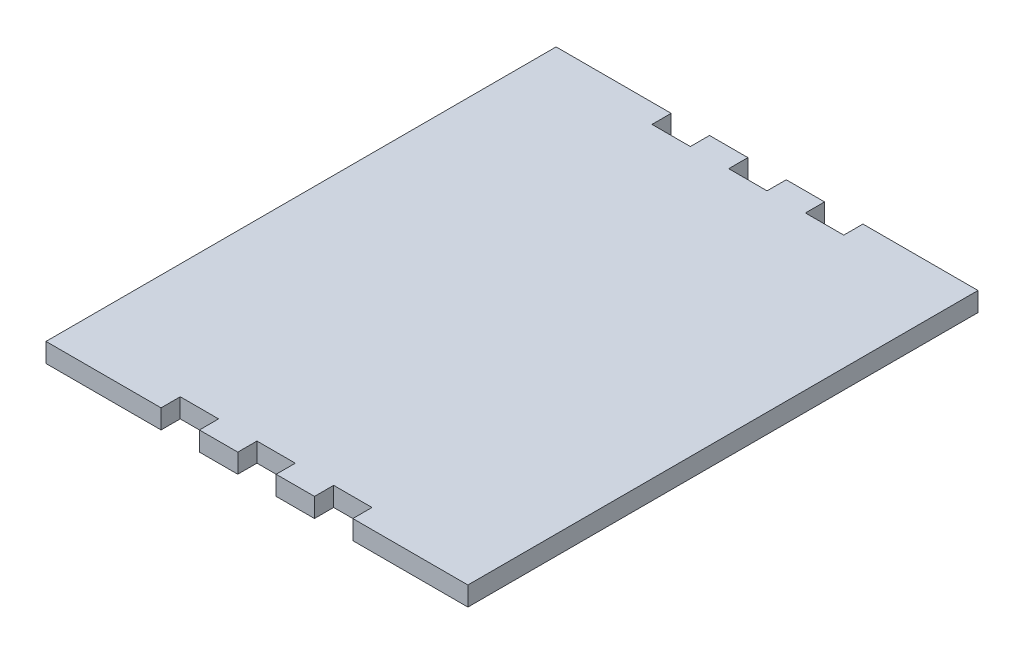
ISO-10303-21;
HEADER;
FILE_DESCRIPTION(('STEP AP214'),'2;1');
FILE_NAME('part.step','',(''),(''),'','','');
FILE_SCHEMA(('AUTOMOTIVE_DESIGN { 1 0 10303 214 1 1 1 1 }'));
ENDSEC;
DATA;
#1=APPLICATION_CONTEXT('core data for automotive mechanical design processes');
#2=APPLICATION_PROTOCOL_DEFINITION('international standard','automotive_design',2000,#1);
#3=PRODUCT_CONTEXT('',#1,'mechanical');
#4=PRODUCT('Part','Part','',(#3));
#5=PRODUCT_RELATED_PRODUCT_CATEGORY('part','',(#4));
#6=PRODUCT_DEFINITION_FORMATION('','',#4);
#7=PRODUCT_DEFINITION_CONTEXT('part definition',#1,'design');
#8=PRODUCT_DEFINITION('design','',#6,#7);
#9=PRODUCT_DEFINITION_SHAPE('','',#8);
#10=(LENGTH_UNIT() NAMED_UNIT(*) SI_UNIT(.MILLI.,.METRE.));
#11=(NAMED_UNIT(*) PLANE_ANGLE_UNIT() SI_UNIT($,.RADIAN.));
#12=(NAMED_UNIT(*) SI_UNIT($,.STERADIAN.) SOLID_ANGLE_UNIT());
#13=UNCERTAINTY_MEASURE_WITH_UNIT(LENGTH_MEASURE(1.E-05),#10,'distance_accuracy_value','');
#14=(GEOMETRIC_REPRESENTATION_CONTEXT(3) GLOBAL_UNCERTAINTY_ASSIGNED_CONTEXT((#13)) GLOBAL_UNIT_ASSIGNED_CONTEXT((#10,
#11,#12)) REPRESENTATION_CONTEXT('',''));
#15=CARTESIAN_POINT('',(0.,0.,0.));
#16=DIRECTION('',(0.,0.,1.));
#17=DIRECTION('',(1.,0.,0.));
#18=AXIS2_PLACEMENT_3D('',#15,#16,#17);
#19=CARTESIAN_POINT('',(-15.875,3.175,-42.2275));
#20=DIRECTION('',(1.,0.,0.));
#21=DIRECTION('',(0.,0.,-1.));
#22=AXIS2_PLACEMENT_3D('',#19,#20,#21);
#23=PLANE('',#22);
#24=DIRECTION('',(0.,0.,1.));
#25=VECTOR('',#24,1.);
#26=CARTESIAN_POINT('',(-15.875,0.,-42.2275));
#27=LINE('',#26,#25);
#28=CARTESIAN_POINT('',(-15.875,0.,-42.2275));
#29=VERTEX_POINT('',#28);
#30=CARTESIAN_POINT('',(-15.875,0.,-39.0525));
#31=VERTEX_POINT('',#30);
#32=EDGE_CURVE('E450',#29,#31,#27,.T.);
#33=ORIENTED_EDGE('',*,*,#32,.F.);
#34=DIRECTION('',(0.,-1.,0.));
#35=VECTOR('',#34,1.);
#36=CARTESIAN_POINT('',(-15.875,3.175,-42.2275));
#37=LINE('',#36,#35);
#38=CARTESIAN_POINT('',(-15.875,3.175,-42.2275));
#39=VERTEX_POINT('',#38);
#40=EDGE_CURVE('E12',#39,#29,#37,.T.);
#41=ORIENTED_EDGE('',*,*,#40,.F.);
#42=DIRECTION('',(0.,0.,1.));
#43=VECTOR('',#42,1.);
#44=CARTESIAN_POINT('',(-15.875,3.175,-42.2275));
#45=LINE('',#44,#43);
#46=CARTESIAN_POINT('',(-15.875,3.175,-39.0525));
#47=VERTEX_POINT('',#46);
#48=EDGE_CURVE('E382',#39,#47,#45,.T.);
#49=ORIENTED_EDGE('',*,*,#48,.T.);
#50=DIRECTION('',(0.,-1.,0.));
#51=VECTOR('',#50,1.);
#52=CARTESIAN_POINT('',(-15.875,3.175,-39.0525));
#53=LINE('',#52,#51);
#54=EDGE_CURVE('E41',#47,#31,#53,.T.);
#55=ORIENTED_EDGE('',*,*,#54,.T.);
#56=EDGE_LOOP('',(#33,#41,#49,#55));
#57=FACE_BOUND('',#56,.T.);
#58=ADVANCED_FACE('F38',(#57),#23,.T.);
#59=CARTESIAN_POINT('',(-34.925,3.175,-42.2275));
#60=DIRECTION('',(0.,0.,-1.));
#61=DIRECTION('',(-1.,0.,0.));
#62=AXIS2_PLACEMENT_3D('',#59,#60,#61);
#63=PLANE('',#62);
#64=DIRECTION('',(1.,0.,0.));
#65=VECTOR('',#64,1.);
#66=CARTESIAN_POINT('',(-34.925,0.,-42.2275));
#67=LINE('',#66,#65);
#68=CARTESIAN_POINT('',(-34.925,0.,-42.2275));
#69=VERTEX_POINT('',#68);
#70=EDGE_CURVE('E385',#69,#29,#67,.T.);
#71=ORIENTED_EDGE('',*,*,#70,.F.);
#72=DIRECTION('',(0.,-1.,0.));
#73=VECTOR('',#72,1.);
#74=CARTESIAN_POINT('',(-34.925,3.175,-42.2275));
#75=LINE('',#74,#73);
#76=CARTESIAN_POINT('',(-34.925,3.175,-42.2275));
#77=VERTEX_POINT('',#76);
#78=EDGE_CURVE('E47',#77,#69,#75,.T.);
#79=ORIENTED_EDGE('',*,*,#78,.F.);
#80=DIRECTION('',(1.,0.,0.));
#81=VECTOR('',#80,1.);
#82=CARTESIAN_POINT('',(-34.925,3.175,-42.2275));
#83=LINE('',#82,#81);
#84=EDGE_CURVE('E248',#77,#39,#83,.T.);
#85=ORIENTED_EDGE('',*,*,#84,.T.);
#86=ORIENTED_EDGE('',*,*,#40,.T.);
#87=EDGE_LOOP('',(#71,#79,#85,#86));
#88=FACE_BOUND('',#87,.T.);
#89=ADVANCED_FACE('F634',(#88),#63,.T.);
#90=CARTESIAN_POINT('',(-34.925,3.175,42.2275));
#91=DIRECTION('',(-1.,0.,0.));
#92=DIRECTION('',(0.,0.,1.));
#93=AXIS2_PLACEMENT_3D('',#90,#91,#92);
#94=PLANE('',#93);
#95=DIRECTION('',(0.,0.,-1.));
#96=VECTOR('',#95,1.);
#97=CARTESIAN_POINT('',(-34.925,0.,42.2275));
#98=LINE('',#97,#96);
#99=CARTESIAN_POINT('',(-34.925,0.,42.2275));
#100=VERTEX_POINT('',#99);
#101=EDGE_CURVE('E233',#100,#69,#98,.T.);
#102=ORIENTED_EDGE('',*,*,#101,.F.);
#103=DIRECTION('',(0.,-1.,0.));
#104=VECTOR('',#103,1.);
#105=CARTESIAN_POINT('',(-34.925,3.175,42.2275));
#106=LINE('',#105,#104);
#107=CARTESIAN_POINT('',(-34.925,3.175,42.2275));
#108=VERTEX_POINT('',#107);
#109=EDGE_CURVE('E227',#108,#100,#106,.T.);
#110=ORIENTED_EDGE('',*,*,#109,.F.);
#111=DIRECTION('',(0.,0.,-1.));
#112=VECTOR('',#111,1.);
#113=CARTESIAN_POINT('',(-34.925,3.175,42.2275));
#114=LINE('',#113,#112);
#115=EDGE_CURVE('E231',#108,#77,#114,.T.);
#116=ORIENTED_EDGE('',*,*,#115,.T.);
#117=ORIENTED_EDGE('',*,*,#78,.T.);
#118=EDGE_LOOP('',(#102,#110,#116,#117));
#119=FACE_BOUND('',#118,.T.);
#120=ADVANCED_FACE('F229',(#119),#94,.T.);
#121=CARTESIAN_POINT('',(-34.925,3.175,42.2275));
#122=DIRECTION('',(0.,0.,-1.));
#123=DIRECTION('',(-1.,0.,0.));
#124=AXIS2_PLACEMENT_3D('',#121,#122,#123);
#125=PLANE('',#124);
#126=DIRECTION('',(1.,0.,0.));
#127=VECTOR('',#126,1.);
#128=CARTESIAN_POINT('',(-34.925,0.,42.2275));
#129=LINE('',#128,#127);
#130=CARTESIAN_POINT('',(-15.875,0.,42.2275));
#131=VERTEX_POINT('',#130);
#132=EDGE_CURVE('E390',#100,#131,#129,.T.);
#133=ORIENTED_EDGE('',*,*,#132,.T.);
#134=DIRECTION('',(0.,-1.,0.));
#135=VECTOR('',#134,1.);
#136=CARTESIAN_POINT('',(-15.875,3.175,42.2275));
#137=LINE('',#136,#135);
#138=CARTESIAN_POINT('',(-15.875,3.175,42.2275));
#139=VERTEX_POINT('',#138);
#140=EDGE_CURVE('E236',#139,#131,#137,.T.);
#141=ORIENTED_EDGE('',*,*,#140,.F.);
#142=DIRECTION('',(1.,0.,0.));
#143=VECTOR('',#142,1.);
#144=CARTESIAN_POINT('',(-34.925,3.175,42.2275));
#145=LINE('',#144,#143);
#146=EDGE_CURVE('E239',#108,#139,#145,.T.);
#147=ORIENTED_EDGE('',*,*,#146,.F.);
#148=ORIENTED_EDGE('',*,*,#109,.T.);
#149=EDGE_LOOP('',(#133,#141,#147,#148));
#150=FACE_BOUND('',#149,.T.);
#151=ADVANCED_FACE('F240',(#150),#125,.F.);
#152=CARTESIAN_POINT('',(-15.875,3.175,42.2275));
#153=DIRECTION('',(-1.,0.,0.));
#154=DIRECTION('',(0.,0.,1.));
#155=AXIS2_PLACEMENT_3D('',#152,#153,#154);
#156=PLANE('',#155);
#157=DIRECTION('',(0.,0.,-1.));
#158=VECTOR('',#157,1.);
#159=CARTESIAN_POINT('',(-15.875,0.,42.2275));
#160=LINE('',#159,#158);
#161=CARTESIAN_POINT('',(-15.875,0.,39.0525));
#162=VERTEX_POINT('',#161);
#163=EDGE_CURVE('E515',#131,#162,#160,.T.);
#164=ORIENTED_EDGE('',*,*,#163,.T.);
#165=DIRECTION('',(0.,-1.,0.));
#166=VECTOR('',#165,1.);
#167=CARTESIAN_POINT('',(-15.875,3.175,39.0525));
#168=LINE('',#167,#166);
#169=CARTESIAN_POINT('',(-15.875,3.175,39.0525));
#170=VERTEX_POINT('',#169);
#171=EDGE_CURVE('E396',#170,#162,#168,.T.);
#172=ORIENTED_EDGE('',*,*,#171,.F.);
#173=DIRECTION('',(0.,0.,-1.));
#174=VECTOR('',#173,1.);
#175=CARTESIAN_POINT('',(-15.875,3.175,42.2275));
#176=LINE('',#175,#174);
#177=EDGE_CURVE('E245',#139,#170,#176,.T.);
#178=ORIENTED_EDGE('',*,*,#177,.F.);
#179=ORIENTED_EDGE('',*,*,#140,.T.);
#180=EDGE_LOOP('',(#164,#172,#178,#179));
#181=FACE_BOUND('',#180,.T.);
#182=ADVANCED_FACE('F518',(#181),#156,.F.);
#183=CARTESIAN_POINT('',(-15.875,3.175,39.0525));
#184=DIRECTION('',(0.,0.,-1.));
#185=DIRECTION('',(-1.,0.,0.));
#186=AXIS2_PLACEMENT_3D('',#183,#184,#185);
#187=PLANE('',#186);
#188=DIRECTION('',(1.,0.,0.));
#189=VECTOR('',#188,1.);
#190=CARTESIAN_POINT('',(-15.875,0.,39.0525));
#191=LINE('',#190,#189);
#192=CARTESIAN_POINT('',(-9.525,0.,39.0525));
#193=VERTEX_POINT('',#192);
#194=EDGE_CURVE('E513',#162,#193,#191,.T.);
#195=ORIENTED_EDGE('',*,*,#194,.T.);
#196=DIRECTION('',(0.,-1.,0.));
#197=VECTOR('',#196,1.);
#198=CARTESIAN_POINT('',(-9.525,3.175,39.0525));
#199=LINE('',#198,#197);
#200=CARTESIAN_POINT('',(-9.525,3.175,39.0525));
#201=VERTEX_POINT('',#200);
#202=EDGE_CURVE('E399',#201,#193,#199,.T.);
#203=ORIENTED_EDGE('',*,*,#202,.F.);
#204=DIRECTION('',(1.,0.,0.));
#205=VECTOR('',#204,1.);
#206=CARTESIAN_POINT('',(-15.875,3.175,39.0525));
#207=LINE('',#206,#205);
#208=EDGE_CURVE('E268',#170,#201,#207,.T.);
#209=ORIENTED_EDGE('',*,*,#208,.F.);
#210=ORIENTED_EDGE('',*,*,#171,.T.);
#211=EDGE_LOOP('',(#195,#203,#209,#210));
#212=FACE_BOUND('',#211,.T.);
#213=ADVANCED_FACE('F525',(#212),#187,.F.);
#214=CARTESIAN_POINT('',(-9.525,3.175,39.0525));
#215=DIRECTION('',(1.,0.,0.));
#216=DIRECTION('',(0.,0.,-1.));
#217=AXIS2_PLACEMENT_3D('',#214,#215,#216);
#218=PLANE('',#217);
#219=DIRECTION('',(0.,0.,1.));
#220=VECTOR('',#219,1.);
#221=CARTESIAN_POINT('',(-9.525,0.,39.0525));
#222=LINE('',#221,#220);
#223=CARTESIAN_POINT('',(-9.52500000000001,0.,42.2275));
#224=VERTEX_POINT('',#223);
#225=EDGE_CURVE('E511',#193,#224,#222,.T.);
#226=ORIENTED_EDGE('',*,*,#225,.T.);
#227=DIRECTION('',(0.,-1.,0.));
#228=VECTOR('',#227,1.);
#229=CARTESIAN_POINT('',(-9.52500000000001,3.175,42.2275));
#230=LINE('',#229,#228);
#231=CARTESIAN_POINT('',(-9.52500000000001,3.175,42.2275));
#232=VERTEX_POINT('',#231);
#233=EDGE_CURVE('E402',#232,#224,#230,.T.);
#234=ORIENTED_EDGE('',*,*,#233,.F.);
#235=DIRECTION('',(0.,0.,1.));
#236=VECTOR('',#235,1.);
#237=CARTESIAN_POINT('',(-9.525,3.175,39.0525));
#238=LINE('',#237,#236);
#239=EDGE_CURVE('E272',#201,#232,#238,.T.);
#240=ORIENTED_EDGE('',*,*,#239,.F.);
#241=ORIENTED_EDGE('',*,*,#202,.T.);
#242=EDGE_LOOP('',(#226,#234,#240,#241));
#243=FACE_BOUND('',#242,.T.);
#244=ADVANCED_FACE('F529',(#243),#218,.F.);
#245=CARTESIAN_POINT('',(-9.52500000000001,3.175,42.2275));
#246=DIRECTION('',(0.,0.,-1.));
#247=DIRECTION('',(-1.,0.,0.));
#248=AXIS2_PLACEMENT_3D('',#245,#246,#247);
#249=PLANE('',#248);
#250=DIRECTION('',(1.,0.,0.));
#251=VECTOR('',#250,1.);
#252=CARTESIAN_POINT('',(-9.52500000000001,0.,42.2275));
#253=LINE('',#252,#251);
#254=CARTESIAN_POINT('',(-3.17500000000001,0.,42.2275));
#255=VERTEX_POINT('',#254);
#256=EDGE_CURVE('E509',#224,#255,#253,.T.);
#257=ORIENTED_EDGE('',*,*,#256,.T.);
#258=DIRECTION('',(0.,-1.,0.));
#259=VECTOR('',#258,1.);
#260=CARTESIAN_POINT('',(-3.17500000000001,3.175,42.2275));
#261=LINE('',#260,#259);
#262=CARTESIAN_POINT('',(-3.17500000000001,3.175,42.2275));
#263=VERTEX_POINT('',#262);
#264=EDGE_CURVE('E405',#263,#255,#261,.T.);
#265=ORIENTED_EDGE('',*,*,#264,.F.);
#266=DIRECTION('',(1.,0.,0.));
#267=VECTOR('',#266,1.);
#268=CARTESIAN_POINT('',(-9.52500000000001,3.175,42.2275));
#269=LINE('',#268,#267);
#270=EDGE_CURVE('E276',#232,#263,#269,.T.);
#271=ORIENTED_EDGE('',*,*,#270,.F.);
#272=ORIENTED_EDGE('',*,*,#233,.T.);
#273=EDGE_LOOP('',(#257,#265,#271,#272));
#274=FACE_BOUND('',#273,.T.);
#275=ADVANCED_FACE('F537',(#274),#249,.F.);
#276=CARTESIAN_POINT('',(-3.17500000000001,3.175,42.2275));
#277=DIRECTION('',(-1.,0.,0.));
#278=DIRECTION('',(0.,0.,1.));
#279=AXIS2_PLACEMENT_3D('',#276,#277,#278);
#280=PLANE('',#279);
#281=DIRECTION('',(0.,0.,-1.));
#282=VECTOR('',#281,1.);
#283=CARTESIAN_POINT('',(-3.17500000000001,0.,42.2275));
#284=LINE('',#283,#282);
#285=CARTESIAN_POINT('',(-3.17500000000001,0.,39.0525));
#286=VERTEX_POINT('',#285);
#287=EDGE_CURVE('E507',#255,#286,#284,.T.);
#288=ORIENTED_EDGE('',*,*,#287,.T.);
#289=DIRECTION('',(0.,-1.,0.));
#290=VECTOR('',#289,1.);
#291=CARTESIAN_POINT('',(-3.17500000000001,3.175,39.0525));
#292=LINE('',#291,#290);
#293=CARTESIAN_POINT('',(-3.17500000000001,3.175,39.0525));
#294=VERTEX_POINT('',#293);
#295=EDGE_CURVE('E408',#294,#286,#292,.T.);
#296=ORIENTED_EDGE('',*,*,#295,.F.);
#297=DIRECTION('',(0.,0.,-1.));
#298=VECTOR('',#297,1.);
#299=CARTESIAN_POINT('',(-3.17500000000001,3.175,42.2275));
#300=LINE('',#299,#298);
#301=EDGE_CURVE('E284',#263,#294,#300,.T.);
#302=ORIENTED_EDGE('',*,*,#301,.F.);
#303=ORIENTED_EDGE('',*,*,#264,.T.);
#304=EDGE_LOOP('',(#288,#296,#302,#303));
#305=FACE_BOUND('',#304,.T.);
#306=ADVANCED_FACE('F540',(#305),#280,.F.);
#307=CARTESIAN_POINT('',(-3.17500000000001,3.175,39.0525));
#308=DIRECTION('',(0.,0.,-1.));
#309=DIRECTION('',(-1.,0.,0.));
#310=AXIS2_PLACEMENT_3D('',#307,#308,#309);
#311=PLANE('',#310);
#312=DIRECTION('',(1.,0.,0.));
#313=VECTOR('',#312,1.);
#314=CARTESIAN_POINT('',(-3.17500000000001,0.,39.0525));
#315=LINE('',#314,#313);
#316=CARTESIAN_POINT('',(3.17499999999999,0.,39.0525));
#317=VERTEX_POINT('',#316);
#318=EDGE_CURVE('E505',#286,#317,#315,.T.);
#319=ORIENTED_EDGE('',*,*,#318,.T.);
#320=DIRECTION('',(0.,-1.,0.));
#321=VECTOR('',#320,1.);
#322=CARTESIAN_POINT('',(3.17499999999999,3.175,39.0525));
#323=LINE('',#322,#321);
#324=CARTESIAN_POINT('',(3.17499999999999,3.175,39.0525));
#325=VERTEX_POINT('',#324);
#326=EDGE_CURVE('E411',#325,#317,#323,.T.);
#327=ORIENTED_EDGE('',*,*,#326,.F.);
#328=DIRECTION('',(1.,0.,0.));
#329=VECTOR('',#328,1.);
#330=CARTESIAN_POINT('',(-3.17500000000001,3.175,39.0525));
#331=LINE('',#330,#329);
#332=EDGE_CURVE('E287',#294,#325,#331,.T.);
#333=ORIENTED_EDGE('',*,*,#332,.F.);
#334=ORIENTED_EDGE('',*,*,#295,.T.);
#335=EDGE_LOOP('',(#319,#327,#333,#334));
#336=FACE_BOUND('',#335,.T.);
#337=ADVANCED_FACE('F545',(#336),#311,.F.);
#338=CARTESIAN_POINT('',(3.17499999999999,3.175,39.0525));
#339=DIRECTION('',(1.,0.,0.));
#340=DIRECTION('',(0.,0.,-1.));
#341=AXIS2_PLACEMENT_3D('',#338,#339,#340);
#342=PLANE('',#341);
#343=DIRECTION('',(0.,0.,1.));
#344=VECTOR('',#343,1.);
#345=CARTESIAN_POINT('',(3.17499999999999,0.,39.0525));
#346=LINE('',#345,#344);
#347=CARTESIAN_POINT('',(3.17499999999999,0.,42.2275));
#348=VERTEX_POINT('',#347);
#349=EDGE_CURVE('E502',#317,#348,#346,.T.);
#350=ORIENTED_EDGE('',*,*,#349,.T.);
#351=DIRECTION('',(0.,-1.,0.));
#352=VECTOR('',#351,1.);
#353=CARTESIAN_POINT('',(3.17499999999999,3.175,42.2275));
#354=LINE('',#353,#352);
#355=CARTESIAN_POINT('',(3.17499999999999,3.175,42.2275));
#356=VERTEX_POINT('',#355);
#357=EDGE_CURVE('E414',#356,#348,#354,.T.);
#358=ORIENTED_EDGE('',*,*,#357,.F.);
#359=DIRECTION('',(0.,0.,1.));
#360=VECTOR('',#359,1.);
#361=CARTESIAN_POINT('',(3.17499999999999,3.175,39.0525));
#362=LINE('',#361,#360);
#363=EDGE_CURVE('E291',#325,#356,#362,.T.);
#364=ORIENTED_EDGE('',*,*,#363,.F.);
#365=ORIENTED_EDGE('',*,*,#326,.T.);
#366=EDGE_LOOP('',(#350,#358,#364,#365));
#367=FACE_BOUND('',#366,.T.);
#368=ADVANCED_FACE('F552',(#367),#342,.F.);
#369=CARTESIAN_POINT('',(9.52499999999999,3.175,42.2275));
#370=DIRECTION('',(0.,0.,1.));
#371=DIRECTION('',(1.,0.,0.));
#372=AXIS2_PLACEMENT_3D('',#369,#370,#371);
#373=PLANE('',#372);
#374=DIRECTION('',(-1.,0.,0.));
#375=VECTOR('',#374,1.);
#376=CARTESIAN_POINT('',(9.52499999999999,0.,42.2275));
#377=LINE('',#376,#375);
#378=CARTESIAN_POINT('',(9.52499999999999,0.,42.2275));
#379=VERTEX_POINT('',#378);
#380=EDGE_CURVE('E499',#379,#348,#377,.T.);
#381=ORIENTED_EDGE('',*,*,#380,.F.);
#382=DIRECTION('',(0.,-1.,0.));
#383=VECTOR('',#382,1.);
#384=CARTESIAN_POINT('',(9.52499999999999,3.175,42.2275));
#385=LINE('',#384,#383);
#386=CARTESIAN_POINT('',(9.52499999999999,3.175,42.2275));
#387=VERTEX_POINT('',#386);
#388=EDGE_CURVE('E416',#387,#379,#385,.T.);
#389=ORIENTED_EDGE('',*,*,#388,.F.);
#390=DIRECTION('',(-1.,0.,0.));
#391=VECTOR('',#390,1.);
#392=CARTESIAN_POINT('',(9.52499999999999,3.175,42.2275));
#393=LINE('',#392,#391);
#394=EDGE_CURVE('E295',#387,#356,#393,.T.);
#395=ORIENTED_EDGE('',*,*,#394,.T.);
#396=ORIENTED_EDGE('',*,*,#357,.T.);
#397=EDGE_LOOP('',(#381,#389,#395,#396));
#398=FACE_BOUND('',#397,.T.);
#399=ADVANCED_FACE('F556',(#398),#373,.T.);
#400=CARTESIAN_POINT('',(9.525,3.175,39.0525));
#401=DIRECTION('',(1.,0.,0.));
#402=DIRECTION('',(0.,0.,-1.));
#403=AXIS2_PLACEMENT_3D('',#400,#401,#402);
#404=PLANE('',#403);
#405=DIRECTION('',(0.,0.,1.));
#406=VECTOR('',#405,1.);
#407=CARTESIAN_POINT('',(9.525,0.,39.0525));
#408=LINE('',#407,#406);
#409=CARTESIAN_POINT('',(9.525,0.,39.0525));
#410=VERTEX_POINT('',#409);
#411=EDGE_CURVE('E496',#410,#379,#408,.T.);
#412=ORIENTED_EDGE('',*,*,#411,.F.);
#413=DIRECTION('',(0.,-1.,0.));
#414=VECTOR('',#413,1.);
#415=CARTESIAN_POINT('',(9.525,3.175,39.0525));
#416=LINE('',#415,#414);
#417=CARTESIAN_POINT('',(9.525,3.175,39.0525));
#418=VERTEX_POINT('',#417);
#419=EDGE_CURVE('E418',#418,#410,#416,.T.);
#420=ORIENTED_EDGE('',*,*,#419,.F.);
#421=DIRECTION('',(0.,0.,1.));
#422=VECTOR('',#421,1.);
#423=CARTESIAN_POINT('',(9.525,3.175,39.0525));
#424=LINE('',#423,#422);
#425=EDGE_CURVE('E303',#418,#387,#424,.T.);
#426=ORIENTED_EDGE('',*,*,#425,.T.);
#427=ORIENTED_EDGE('',*,*,#388,.T.);
#428=EDGE_LOOP('',(#412,#420,#426,#427));
#429=FACE_BOUND('',#428,.T.);
#430=ADVANCED_FACE('F624',(#429),#404,.T.);
#431=CARTESIAN_POINT('',(15.875,3.175,39.0525));
#432=DIRECTION('',(0.,0.,1.));
#433=DIRECTION('',(1.,0.,0.));
#434=AXIS2_PLACEMENT_3D('',#431,#432,#433);
#435=PLANE('',#434);
#436=DIRECTION('',(-1.,0.,0.));
#437=VECTOR('',#436,1.);
#438=CARTESIAN_POINT('',(15.875,0.,39.0525));
#439=LINE('',#438,#437);
#440=CARTESIAN_POINT('',(15.875,0.,39.0525));
#441=VERTEX_POINT('',#440);
#442=EDGE_CURVE('E493',#441,#410,#439,.T.);
#443=ORIENTED_EDGE('',*,*,#442,.F.);
#444=DIRECTION('',(0.,-1.,0.));
#445=VECTOR('',#444,1.);
#446=CARTESIAN_POINT('',(15.875,3.175,39.0525));
#447=LINE('',#446,#445);
#448=CARTESIAN_POINT('',(15.875,3.175,39.0525));
#449=VERTEX_POINT('',#448);
#450=EDGE_CURVE('E420',#449,#441,#447,.T.);
#451=ORIENTED_EDGE('',*,*,#450,.F.);
#452=DIRECTION('',(-1.,0.,0.));
#453=VECTOR('',#452,1.);
#454=CARTESIAN_POINT('',(15.875,3.175,39.0525));
#455=LINE('',#454,#453);
#456=EDGE_CURVE('E307',#449,#418,#455,.T.);
#457=ORIENTED_EDGE('',*,*,#456,.T.);
#458=ORIENTED_EDGE('',*,*,#419,.T.);
#459=EDGE_LOOP('',(#443,#451,#457,#458));
#460=FACE_BOUND('',#459,.T.);
#461=ADVANCED_FACE('F621',(#460),#435,.T.);
#462=CARTESIAN_POINT('',(15.875,3.175,42.2275));
#463=DIRECTION('',(-1.,0.,0.));
#464=DIRECTION('',(0.,0.,1.));
#465=AXIS2_PLACEMENT_3D('',#462,#463,#464);
#466=PLANE('',#465);
#467=DIRECTION('',(0.,0.,-1.));
#468=VECTOR('',#467,1.);
#469=CARTESIAN_POINT('',(15.875,0.,42.2275));
#470=LINE('',#469,#468);
#471=CARTESIAN_POINT('',(15.875,0.,42.2275));
#472=VERTEX_POINT('',#471);
#473=EDGE_CURVE('E490',#472,#441,#470,.T.);
#474=ORIENTED_EDGE('',*,*,#473,.F.);
#475=DIRECTION('',(0.,-1.,0.));
#476=VECTOR('',#475,1.);
#477=CARTESIAN_POINT('',(15.875,3.175,42.2275));
#478=LINE('',#477,#476);
#479=CARTESIAN_POINT('',(15.875,3.175,42.2275));
#480=VERTEX_POINT('',#479);
#481=EDGE_CURVE('E422',#480,#472,#478,.T.);
#482=ORIENTED_EDGE('',*,*,#481,.F.);
#483=DIRECTION('',(0.,0.,-1.));
#484=VECTOR('',#483,1.);
#485=CARTESIAN_POINT('',(15.875,3.175,42.2275));
#486=LINE('',#485,#484);
#487=EDGE_CURVE('E312',#480,#449,#486,.T.);
#488=ORIENTED_EDGE('',*,*,#487,.T.);
#489=ORIENTED_EDGE('',*,*,#450,.T.);
#490=EDGE_LOOP('',(#474,#482,#488,#489));
#491=FACE_BOUND('',#490,.T.);
#492=ADVANCED_FACE('F617',(#491),#466,.T.);
#493=CARTESIAN_POINT('',(15.875,3.175,42.2275));
#494=DIRECTION('',(0.,0.,-1.));
#495=DIRECTION('',(-1.,0.,0.));
#496=AXIS2_PLACEMENT_3D('',#493,#494,#495);
#497=PLANE('',#496);
#498=DIRECTION('',(1.,0.,0.));
#499=VECTOR('',#498,1.);
#500=CARTESIAN_POINT('',(15.875,0.,42.2275));
#501=LINE('',#500,#499);
#502=CARTESIAN_POINT('',(34.925,0.,42.2275));
#503=VERTEX_POINT('',#502);
#504=EDGE_CURVE('E488',#472,#503,#501,.T.);
#505=ORIENTED_EDGE('',*,*,#504,.T.);
#506=DIRECTION('',(0.,-1.,0.));
#507=VECTOR('',#506,1.);
#508=CARTESIAN_POINT('',(34.925,3.175,42.2275));
#509=LINE('',#508,#507);
#510=CARTESIAN_POINT('',(34.925,3.175,42.2275));
#511=VERTEX_POINT('',#510);
#512=EDGE_CURVE('E424',#511,#503,#509,.T.);
#513=ORIENTED_EDGE('',*,*,#512,.F.);
#514=DIRECTION('',(1.,0.,0.));
#515=VECTOR('',#514,1.);
#516=CARTESIAN_POINT('',(15.875,3.175,42.2275));
#517=LINE('',#516,#515);
#518=EDGE_CURVE('E317',#480,#511,#517,.T.);
#519=ORIENTED_EDGE('',*,*,#518,.F.);
#520=ORIENTED_EDGE('',*,*,#481,.T.);
#521=EDGE_LOOP('',(#505,#513,#519,#520));
#522=FACE_BOUND('',#521,.T.);
#523=ADVANCED_FACE('F614',(#522),#497,.F.);
#524=CARTESIAN_POINT('',(34.925,3.175,42.2275));
#525=DIRECTION('',(-1.,0.,0.));
#526=DIRECTION('',(0.,0.,1.));
#527=AXIS2_PLACEMENT_3D('',#524,#525,#526);
#528=PLANE('',#527);
#529=DIRECTION('',(0.,0.,-1.));
#530=VECTOR('',#529,1.);
#531=CARTESIAN_POINT('',(34.925,0.,42.2275));
#532=LINE('',#531,#530);
#533=CARTESIAN_POINT('',(34.925,0.,-42.2275));
#534=VERTEX_POINT('',#533);
#535=EDGE_CURVE('E485',#503,#534,#532,.T.);
#536=ORIENTED_EDGE('',*,*,#535,.T.);
#537=DIRECTION('',(0.,-1.,0.));
#538=VECTOR('',#537,1.);
#539=CARTESIAN_POINT('',(34.925,3.175,-42.2275));
#540=LINE('',#539,#538);
#541=CARTESIAN_POINT('',(34.925,3.175,-42.2275));
#542=VERTEX_POINT('',#541);
#543=EDGE_CURVE('E427',#542,#534,#540,.T.);
#544=ORIENTED_EDGE('',*,*,#543,.F.);
#545=DIRECTION('',(0.,0.,-1.));
#546=VECTOR('',#545,1.);
#547=CARTESIAN_POINT('',(34.925,3.175,42.2275));
#548=LINE('',#547,#546);
#549=EDGE_CURVE('E325',#511,#542,#548,.T.);
#550=ORIENTED_EDGE('',*,*,#549,.F.);
#551=ORIENTED_EDGE('',*,*,#512,.T.);
#552=EDGE_LOOP('',(#536,#544,#550,#551));
#553=FACE_BOUND('',#552,.T.);
#554=ADVANCED_FACE('F609',(#553),#528,.F.);
#555=CARTESIAN_POINT('',(15.875,3.175,-42.2275));
#556=DIRECTION('',(0.,0.,-1.));
#557=DIRECTION('',(-1.,0.,0.));
#558=AXIS2_PLACEMENT_3D('',#555,#556,#557);
#559=PLANE('',#558);
#560=DIRECTION('',(1.,0.,0.));
#561=VECTOR('',#560,1.);
#562=CARTESIAN_POINT('',(15.875,0.,-42.2275));
#563=LINE('',#562,#561);
#564=CARTESIAN_POINT('',(15.875,0.,-42.2275));
#565=VERTEX_POINT('',#564);
#566=EDGE_CURVE('E482',#565,#534,#563,.T.);
#567=ORIENTED_EDGE('',*,*,#566,.F.);
#568=DIRECTION('',(0.,-1.,0.));
#569=VECTOR('',#568,1.);
#570=CARTESIAN_POINT('',(15.875,3.175,-42.2275));
#571=LINE('',#570,#569);
#572=CARTESIAN_POINT('',(15.875,3.175,-42.2275));
#573=VERTEX_POINT('',#572);
#574=EDGE_CURVE('E429',#573,#565,#571,.T.);
#575=ORIENTED_EDGE('',*,*,#574,.F.);
#576=DIRECTION('',(1.,0.,0.));
#577=VECTOR('',#576,1.);
#578=CARTESIAN_POINT('',(15.875,3.175,-42.2275));
#579=LINE('',#578,#577);
#580=EDGE_CURVE('E328',#573,#542,#579,.T.);
#581=ORIENTED_EDGE('',*,*,#580,.T.);
#582=ORIENTED_EDGE('',*,*,#543,.T.);
#583=EDGE_LOOP('',(#567,#575,#581,#582));
#584=FACE_BOUND('',#583,.T.);
#585=ADVANCED_FACE('F603',(#584),#559,.T.);
#586=CARTESIAN_POINT('',(15.875,3.175,-42.2275));
#587=DIRECTION('',(1.,0.,0.));
#588=DIRECTION('',(0.,0.,-1.));
#589=AXIS2_PLACEMENT_3D('',#586,#587,#588);
#590=PLANE('',#589);
#591=DIRECTION('',(0.,0.,1.));
#592=VECTOR('',#591,1.);
#593=CARTESIAN_POINT('',(15.875,0.,-42.2275));
#594=LINE('',#593,#592);
#595=CARTESIAN_POINT('',(15.875,0.,-39.0525));
#596=VERTEX_POINT('',#595);
#597=EDGE_CURVE('E480',#565,#596,#594,.T.);
#598=ORIENTED_EDGE('',*,*,#597,.T.);
#599=DIRECTION('',(0.,-1.,0.));
#600=VECTOR('',#599,1.);
#601=CARTESIAN_POINT('',(15.875,3.175,-39.0525));
#602=LINE('',#601,#600);
#603=CARTESIAN_POINT('',(15.875,3.175,-39.0525));
#604=VERTEX_POINT('',#603);
#605=EDGE_CURVE('E431',#604,#596,#602,.T.);
#606=ORIENTED_EDGE('',*,*,#605,.F.);
#607=DIRECTION('',(0.,0.,1.));
#608=VECTOR('',#607,1.);
#609=CARTESIAN_POINT('',(15.875,3.175,-42.2275));
#610=LINE('',#609,#608);
#611=EDGE_CURVE('E333',#573,#604,#610,.T.);
#612=ORIENTED_EDGE('',*,*,#611,.F.);
#613=ORIENTED_EDGE('',*,*,#574,.T.);
#614=EDGE_LOOP('',(#598,#606,#612,#613));
#615=FACE_BOUND('',#614,.T.);
#616=ADVANCED_FACE('F600',(#615),#590,.F.);
#617=CARTESIAN_POINT('',(15.875,3.175,-39.0525));
#618=DIRECTION('',(0.,0.,1.));
#619=DIRECTION('',(1.,0.,0.));
#620=AXIS2_PLACEMENT_3D('',#617,#618,#619);
#621=PLANE('',#620);
#622=DIRECTION('',(-1.,0.,0.));
#623=VECTOR('',#622,1.);
#624=CARTESIAN_POINT('',(15.875,0.,-39.0525));
#625=LINE('',#624,#623);
#626=CARTESIAN_POINT('',(9.525,0.,-39.0525));
#627=VERTEX_POINT('',#626);
#628=EDGE_CURVE('E478',#596,#627,#625,.T.);
#629=ORIENTED_EDGE('',*,*,#628,.T.);
#630=DIRECTION('',(0.,-1.,0.));
#631=VECTOR('',#630,1.);
#632=CARTESIAN_POINT('',(9.525,3.175,-39.0525));
#633=LINE('',#632,#631);
#634=CARTESIAN_POINT('',(9.525,3.175,-39.0525));
#635=VERTEX_POINT('',#634);
#636=EDGE_CURVE('E434',#635,#627,#633,.T.);
#637=ORIENTED_EDGE('',*,*,#636,.F.);
#638=DIRECTION('',(-1.,0.,0.));
#639=VECTOR('',#638,1.);
#640=CARTESIAN_POINT('',(15.875,3.175,-39.0525));
#641=LINE('',#640,#639);
#642=EDGE_CURVE('E337',#604,#635,#641,.T.);
#643=ORIENTED_EDGE('',*,*,#642,.F.);
#644=ORIENTED_EDGE('',*,*,#605,.T.);
#645=EDGE_LOOP('',(#629,#637,#643,#644));
#646=FACE_BOUND('',#645,.T.);
#647=ADVANCED_FACE('F595',(#646),#621,.F.);
#648=CARTESIAN_POINT('',(9.525,3.175,-39.0525));
#649=DIRECTION('',(-1.,0.,0.));
#650=DIRECTION('',(0.,0.,1.));
#651=AXIS2_PLACEMENT_3D('',#648,#649,#650);
#652=PLANE('',#651);
#653=DIRECTION('',(0.,0.,-1.));
#654=VECTOR('',#653,1.);
#655=CARTESIAN_POINT('',(9.525,0.,-39.0525));
#656=LINE('',#655,#654);
#657=CARTESIAN_POINT('',(9.52499999999999,0.,-42.2275));
#658=VERTEX_POINT('',#657);
#659=EDGE_CURVE('E475',#627,#658,#656,.T.);
#660=ORIENTED_EDGE('',*,*,#659,.T.);
#661=DIRECTION('',(0.,-1.,0.));
#662=VECTOR('',#661,1.);
#663=CARTESIAN_POINT('',(9.52499999999999,3.175,-42.2275));
#664=LINE('',#663,#662);
#665=CARTESIAN_POINT('',(9.52499999999999,3.175,-42.2275));
#666=VERTEX_POINT('',#665);
#667=EDGE_CURVE('E437',#666,#658,#664,.T.);
#668=ORIENTED_EDGE('',*,*,#667,.F.);
#669=DIRECTION('',(0.,0.,-1.));
#670=VECTOR('',#669,1.);
#671=CARTESIAN_POINT('',(9.525,3.175,-39.0525));
#672=LINE('',#671,#670);
#673=EDGE_CURVE('E345',#635,#666,#672,.T.);
#674=ORIENTED_EDGE('',*,*,#673,.F.);
#675=ORIENTED_EDGE('',*,*,#636,.T.);
#676=EDGE_LOOP('',(#660,#668,#674,#675));
#677=FACE_BOUND('',#676,.T.);
#678=ADVANCED_FACE('F589',(#677),#652,.F.);
#679=CARTESIAN_POINT('',(3.17499999999999,3.175,-42.2275));
#680=DIRECTION('',(0.,0.,-1.));
#681=DIRECTION('',(-1.,0.,0.));
#682=AXIS2_PLACEMENT_3D('',#679,#680,#681);
#683=PLANE('',#682);
#684=DIRECTION('',(1.,0.,0.));
#685=VECTOR('',#684,1.);
#686=CARTESIAN_POINT('',(3.17499999999999,0.,-42.2275));
#687=LINE('',#686,#685);
#688=CARTESIAN_POINT('',(3.17499999999999,0.,-42.2275));
#689=VERTEX_POINT('',#688);
#690=EDGE_CURVE('E472',#689,#658,#687,.T.);
#691=ORIENTED_EDGE('',*,*,#690,.F.);
#692=DIRECTION('',(0.,-1.,0.));
#693=VECTOR('',#692,1.);
#694=CARTESIAN_POINT('',(3.17499999999999,3.175,-42.2275));
#695=LINE('',#694,#693);
#696=CARTESIAN_POINT('',(3.17499999999999,3.175,-42.2275));
#697=VERTEX_POINT('',#696);
#698=EDGE_CURVE('E439',#697,#689,#695,.T.);
#699=ORIENTED_EDGE('',*,*,#698,.F.);
#700=DIRECTION('',(1.,0.,0.));
#701=VECTOR('',#700,1.);
#702=CARTESIAN_POINT('',(3.17499999999999,3.175,-42.2275));
#703=LINE('',#702,#701);
#704=EDGE_CURVE('E348',#697,#666,#703,.T.);
#705=ORIENTED_EDGE('',*,*,#704,.T.);
#706=ORIENTED_EDGE('',*,*,#667,.T.);
#707=EDGE_LOOP('',(#691,#699,#705,#706));
#708=FACE_BOUND('',#707,.T.);
#709=ADVANCED_FACE('F585',(#708),#683,.T.);
#710=CARTESIAN_POINT('',(3.17499999999999,3.175,-39.0525));
#711=DIRECTION('',(-1.,0.,0.));
#712=DIRECTION('',(0.,0.,1.));
#713=AXIS2_PLACEMENT_3D('',#710,#711,#712);
#714=PLANE('',#713);
#715=DIRECTION('',(0.,0.,-1.));
#716=VECTOR('',#715,1.);
#717=CARTESIAN_POINT('',(3.17499999999999,0.,-39.0525));
#718=LINE('',#717,#716);
#719=CARTESIAN_POINT('',(3.17499999999999,0.,-39.0525));
#720=VERTEX_POINT('',#719);
#721=EDGE_CURVE('E469',#720,#689,#718,.T.);
#722=ORIENTED_EDGE('',*,*,#721,.F.);
#723=DIRECTION('',(0.,-1.,0.));
#724=VECTOR('',#723,1.);
#725=CARTESIAN_POINT('',(3.17499999999999,3.175,-39.0525));
#726=LINE('',#725,#724);
#727=CARTESIAN_POINT('',(3.17499999999999,3.175,-39.0525));
#728=VERTEX_POINT('',#727);
#729=EDGE_CURVE('E441',#728,#720,#726,.T.);
#730=ORIENTED_EDGE('',*,*,#729,.F.);
#731=DIRECTION('',(0.,0.,-1.));
#732=VECTOR('',#731,1.);
#733=CARTESIAN_POINT('',(3.17499999999999,3.175,-39.0525));
#734=LINE('',#733,#732);
#735=EDGE_CURVE('E353',#728,#697,#734,.T.);
#736=ORIENTED_EDGE('',*,*,#735,.T.);
#737=ORIENTED_EDGE('',*,*,#698,.T.);
#738=EDGE_LOOP('',(#722,#730,#736,#737));
#739=FACE_BOUND('',#738,.T.);
#740=ADVANCED_FACE('F583',(#739),#714,.T.);
#741=CARTESIAN_POINT('',(-3.17500000000001,3.175,-39.0525));
#742=DIRECTION('',(0.,0.,-1.));
#743=DIRECTION('',(-1.,0.,0.));
#744=AXIS2_PLACEMENT_3D('',#741,#742,#743);
#745=PLANE('',#744);
#746=DIRECTION('',(1.,0.,0.));
#747=VECTOR('',#746,1.);
#748=CARTESIAN_POINT('',(-3.17500000000001,0.,-39.0525));
#749=LINE('',#748,#747);
#750=CARTESIAN_POINT('',(-3.17500000000001,0.,-39.0525));
#751=VERTEX_POINT('',#750);
#752=EDGE_CURVE('E466',#751,#720,#749,.T.);
#753=ORIENTED_EDGE('',*,*,#752,.F.);
#754=DIRECTION('',(0.,-1.,0.));
#755=VECTOR('',#754,1.);
#756=CARTESIAN_POINT('',(-3.17500000000001,3.175,-39.0525));
#757=LINE('',#756,#755);
#758=CARTESIAN_POINT('',(-3.17500000000001,3.175,-39.0525));
#759=VERTEX_POINT('',#758);
#760=EDGE_CURVE('E443',#759,#751,#757,.T.);
#761=ORIENTED_EDGE('',*,*,#760,.F.);
#762=DIRECTION('',(1.,0.,0.));
#763=VECTOR('',#762,1.);
#764=CARTESIAN_POINT('',(-3.17500000000001,3.175,-39.0525));
#765=LINE('',#764,#763);
#766=EDGE_CURVE('E358',#759,#728,#765,.T.);
#767=ORIENTED_EDGE('',*,*,#766,.T.);
#768=ORIENTED_EDGE('',*,*,#729,.T.);
#769=EDGE_LOOP('',(#753,#761,#767,#768));
#770=FACE_BOUND('',#769,.T.);
#771=ADVANCED_FACE('F565',(#770),#745,.T.);
#772=CARTESIAN_POINT('',(-3.17500000000001,3.175,-42.2275));
#773=DIRECTION('',(1.,0.,0.));
#774=DIRECTION('',(0.,0.,-1.));
#775=AXIS2_PLACEMENT_3D('',#772,#773,#774);
#776=PLANE('',#775);
#777=DIRECTION('',(0.,0.,1.));
#778=VECTOR('',#777,1.);
#779=CARTESIAN_POINT('',(-3.17500000000001,0.,-42.2275));
#780=LINE('',#779,#778);
#781=CARTESIAN_POINT('',(-3.17500000000001,0.,-42.2275));
#782=VERTEX_POINT('',#781);
#783=EDGE_CURVE('E463',#782,#751,#780,.T.);
#784=ORIENTED_EDGE('',*,*,#783,.F.);
#785=DIRECTION('',(0.,-1.,0.));
#786=VECTOR('',#785,1.);
#787=CARTESIAN_POINT('',(-3.17500000000001,3.175,-42.2275));
#788=LINE('',#787,#786);
#789=CARTESIAN_POINT('',(-3.17500000000001,3.175,-42.2275));
#790=VERTEX_POINT('',#789);
#791=EDGE_CURVE('E445',#790,#782,#788,.T.);
#792=ORIENTED_EDGE('',*,*,#791,.F.);
#793=DIRECTION('',(0.,0.,1.));
#794=VECTOR('',#793,1.);
#795=CARTESIAN_POINT('',(-3.17500000000001,3.175,-42.2275));
#796=LINE('',#795,#794);
#797=EDGE_CURVE('E365',#790,#759,#796,.T.);
#798=ORIENTED_EDGE('',*,*,#797,.T.);
#799=ORIENTED_EDGE('',*,*,#760,.T.);
#800=EDGE_LOOP('',(#784,#792,#798,#799));
#801=FACE_BOUND('',#800,.T.);
#802=ADVANCED_FACE('F573',(#801),#776,.T.);
#803=CARTESIAN_POINT('',(-9.52500000000001,3.175,-42.2275));
#804=DIRECTION('',(0.,0.,-1.));
#805=DIRECTION('',(-1.,0.,0.));
#806=AXIS2_PLACEMENT_3D('',#803,#804,#805);
#807=PLANE('',#806);
#808=DIRECTION('',(1.,0.,0.));
#809=VECTOR('',#808,1.);
#810=CARTESIAN_POINT('',(-9.52500000000001,0.,-42.2275));
#811=LINE('',#810,#809);
#812=CARTESIAN_POINT('',(-9.52500000000001,0.,-42.2275));
#813=VERTEX_POINT('',#812);
#814=EDGE_CURVE('E460',#813,#782,#811,.T.);
#815=ORIENTED_EDGE('',*,*,#814,.F.);
#816=DIRECTION('',(0.,-1.,0.));
#817=VECTOR('',#816,1.);
#818=CARTESIAN_POINT('',(-9.52500000000001,3.175,-42.2275));
#819=LINE('',#818,#817);
#820=CARTESIAN_POINT('',(-9.52500000000001,3.175,-42.2275));
#821=VERTEX_POINT('',#820);
#822=EDGE_CURVE('E447',#821,#813,#819,.T.);
#823=ORIENTED_EDGE('',*,*,#822,.F.);
#824=DIRECTION('',(1.,0.,0.));
#825=VECTOR('',#824,1.);
#826=CARTESIAN_POINT('',(-9.52500000000001,3.175,-42.2275));
#827=LINE('',#826,#825);
#828=EDGE_CURVE('E369',#821,#790,#827,.T.);
#829=ORIENTED_EDGE('',*,*,#828,.T.);
#830=ORIENTED_EDGE('',*,*,#791,.T.);
#831=EDGE_LOOP('',(#815,#823,#829,#830));
#832=FACE_BOUND('',#831,.T.);
#833=ADVANCED_FACE('F576',(#832),#807,.T.);
#834=CARTESIAN_POINT('',(-9.525,3.175,-39.0525));
#835=DIRECTION('',(-1.,0.,0.));
#836=DIRECTION('',(0.,0.,1.));
#837=AXIS2_PLACEMENT_3D('',#834,#835,#836);
#838=PLANE('',#837);
#839=DIRECTION('',(0.,0.,-1.));
#840=VECTOR('',#839,1.);
#841=CARTESIAN_POINT('',(-9.525,0.,-39.0525));
#842=LINE('',#841,#840);
#843=CARTESIAN_POINT('',(-9.525,0.,-39.0525));
#844=VERTEX_POINT('',#843);
#845=EDGE_CURVE('E455',#844,#813,#842,.T.);
#846=ORIENTED_EDGE('',*,*,#845,.F.);
#847=DIRECTION('',(0.,-1.,0.));
#848=VECTOR('',#847,1.);
#849=CARTESIAN_POINT('',(-9.525,3.175,-39.0525));
#850=LINE('',#849,#848);
#851=CARTESIAN_POINT('',(-9.525,3.175,-39.0525));
#852=VERTEX_POINT('',#851);
#853=EDGE_CURVE('E448',#852,#844,#850,.T.);
#854=ORIENTED_EDGE('',*,*,#853,.F.);
#855=DIRECTION('',(0.,0.,-1.));
#856=VECTOR('',#855,1.);
#857=CARTESIAN_POINT('',(-9.525,3.175,-39.0525));
#858=LINE('',#857,#856);
#859=EDGE_CURVE('E374',#852,#821,#858,.T.);
#860=ORIENTED_EDGE('',*,*,#859,.T.);
#861=ORIENTED_EDGE('',*,*,#822,.T.);
#862=EDGE_LOOP('',(#846,#854,#860,#861));
#863=FACE_BOUND('',#862,.T.);
#864=ADVANCED_FACE('F579',(#863),#838,.T.);
#865=CARTESIAN_POINT('',(-15.875,3.175,-39.0525));
#866=DIRECTION('',(0.,0.,-1.));
#867=DIRECTION('',(-1.,0.,0.));
#868=AXIS2_PLACEMENT_3D('',#865,#866,#867);
#869=PLANE('',#868);
#870=DIRECTION('',(1.,0.,0.));
#871=VECTOR('',#870,1.);
#872=CARTESIAN_POINT('',(-15.875,0.,-39.0525));
#873=LINE('',#872,#871);
#874=EDGE_CURVE('E452',#31,#844,#873,.T.);
#875=ORIENTED_EDGE('',*,*,#874,.F.);
#876=ORIENTED_EDGE('',*,*,#54,.F.);
#877=DIRECTION('',(1.,0.,0.));
#878=VECTOR('',#877,1.);
#879=CARTESIAN_POINT('',(-15.875,3.175,-39.0525));
#880=LINE('',#879,#878);
#881=EDGE_CURVE('E378',#47,#852,#880,.T.);
#882=ORIENTED_EDGE('',*,*,#881,.T.);
#883=ORIENTED_EDGE('',*,*,#853,.T.);
#884=EDGE_LOOP('',(#875,#876,#882,#883));
#885=FACE_BOUND('',#884,.T.);
#886=ADVANCED_FACE('F453',(#885),#869,.T.);
#887=CARTESIAN_POINT('',(0.,3.175,0.));
#888=DIRECTION('',(0.,1.,0.));
#889=DIRECTION('',(0.,0.,1.));
#890=AXIS2_PLACEMENT_3D('',#887,#888,#889);
#891=PLANE('',#890);
#892=ORIENTED_EDGE('',*,*,#48,.F.);
#893=ORIENTED_EDGE('',*,*,#84,.F.);
#894=ORIENTED_EDGE('',*,*,#115,.F.);
#895=ORIENTED_EDGE('',*,*,#146,.T.);
#896=ORIENTED_EDGE('',*,*,#177,.T.);
#897=ORIENTED_EDGE('',*,*,#208,.T.);
#898=ORIENTED_EDGE('',*,*,#239,.T.);
#899=ORIENTED_EDGE('',*,*,#270,.T.);
#900=ORIENTED_EDGE('',*,*,#301,.T.);
#901=ORIENTED_EDGE('',*,*,#332,.T.);
#902=ORIENTED_EDGE('',*,*,#363,.T.);
#903=ORIENTED_EDGE('',*,*,#394,.F.);
#904=ORIENTED_EDGE('',*,*,#425,.F.);
#905=ORIENTED_EDGE('',*,*,#456,.F.);
#906=ORIENTED_EDGE('',*,*,#487,.F.);
#907=ORIENTED_EDGE('',*,*,#518,.T.);
#908=ORIENTED_EDGE('',*,*,#549,.T.);
#909=ORIENTED_EDGE('',*,*,#580,.F.);
#910=ORIENTED_EDGE('',*,*,#611,.T.);
#911=ORIENTED_EDGE('',*,*,#642,.T.);
#912=ORIENTED_EDGE('',*,*,#673,.T.);
#913=ORIENTED_EDGE('',*,*,#704,.F.);
#914=ORIENTED_EDGE('',*,*,#735,.F.);
#915=ORIENTED_EDGE('',*,*,#766,.F.);
#916=ORIENTED_EDGE('',*,*,#797,.F.);
#917=ORIENTED_EDGE('',*,*,#828,.F.);
#918=ORIENTED_EDGE('',*,*,#859,.F.);
#919=ORIENTED_EDGE('',*,*,#881,.F.);
#920=EDGE_LOOP('',(#892,#893,#894,#895,#896,#897,#898,#899,#900,#901,#902,#903,#904,#905,#906,
#907,#908,#909,#910,#911,#912,#913,#914,#915,#916,#917,#918,#919));
#921=FACE_BOUND('',#920,.T.);
#922=ADVANCED_FACE('F247',(#921),#891,.T.);
#923=CARTESIAN_POINT('',(0.,0.,0.));
#924=DIRECTION('',(0.,1.,0.));
#925=DIRECTION('',(0.,0.,1.));
#926=AXIS2_PLACEMENT_3D('',#923,#924,#925);
#927=PLANE('',#926);
#928=ORIENTED_EDGE('',*,*,#32,.T.);
#929=ORIENTED_EDGE('',*,*,#874,.T.);
#930=ORIENTED_EDGE('',*,*,#845,.T.);
#931=ORIENTED_EDGE('',*,*,#814,.T.);
#932=ORIENTED_EDGE('',*,*,#783,.T.);
#933=ORIENTED_EDGE('',*,*,#752,.T.);
#934=ORIENTED_EDGE('',*,*,#721,.T.);
#935=ORIENTED_EDGE('',*,*,#690,.T.);
#936=ORIENTED_EDGE('',*,*,#659,.F.);
#937=ORIENTED_EDGE('',*,*,#628,.F.);
#938=ORIENTED_EDGE('',*,*,#597,.F.);
#939=ORIENTED_EDGE('',*,*,#566,.T.);
#940=ORIENTED_EDGE('',*,*,#535,.F.);
#941=ORIENTED_EDGE('',*,*,#504,.F.);
#942=ORIENTED_EDGE('',*,*,#473,.T.);
#943=ORIENTED_EDGE('',*,*,#442,.T.);
#944=ORIENTED_EDGE('',*,*,#411,.T.);
#945=ORIENTED_EDGE('',*,*,#380,.T.);
#946=ORIENTED_EDGE('',*,*,#349,.F.);
#947=ORIENTED_EDGE('',*,*,#318,.F.);
#948=ORIENTED_EDGE('',*,*,#287,.F.);
#949=ORIENTED_EDGE('',*,*,#256,.F.);
#950=ORIENTED_EDGE('',*,*,#225,.F.);
#951=ORIENTED_EDGE('',*,*,#194,.F.);
#952=ORIENTED_EDGE('',*,*,#163,.F.);
#953=ORIENTED_EDGE('',*,*,#132,.F.);
#954=ORIENTED_EDGE('',*,*,#101,.T.);
#955=ORIENTED_EDGE('',*,*,#70,.T.);
#956=EDGE_LOOP('',(#928,#929,#930,#931,#932,#933,#934,#935,#936,#937,#938,#939,#940,#941,#942,
#943,#944,#945,#946,#947,#948,#949,#950,#951,#952,#953,#954,#955));
#957=FACE_BOUND('',#956,.T.);
#958=ADVANCED_FACE('F457',(#957),#927,.F.);
#959=CLOSED_SHELL('',(#58,#89,#120,#151,#182,#213,#244,#275,#306,#337,#368,#399,#430,#461,#492,
#523,#554,#585,#616,#647,#678,#709,#740,#771,#802,#833,#864,#886,#922,#958));
#960=MANIFOLD_SOLID_BREP('B2',#959);
#961=ADVANCED_BREP_SHAPE_REPRESENTATION('',(#18,#960),#14);
#962=SHAPE_DEFINITION_REPRESENTATION(#9,#961);
ENDSEC;
END-ISO-10303-21;
